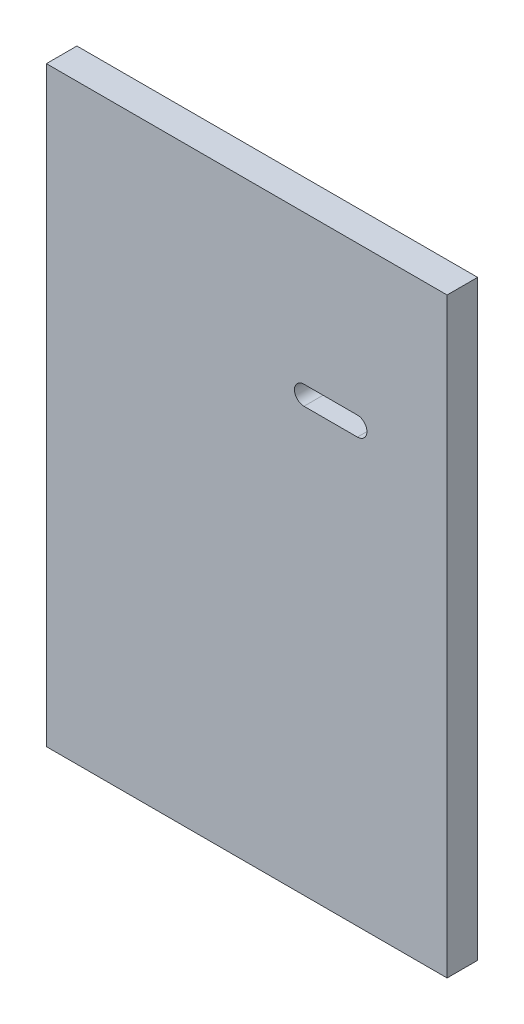
ISO-10303-21;
HEADER;
FILE_DESCRIPTION(('STEP AP214'),'2;1');
FILE_NAME('part.step','',(''),(''),'','','');
FILE_SCHEMA(('AUTOMOTIVE_DESIGN { 1 0 10303 214 1 1 1 1 }'));
ENDSEC;
DATA;
#1=APPLICATION_CONTEXT('core data for automotive mechanical design processes');
#2=APPLICATION_PROTOCOL_DEFINITION('international standard','automotive_design',2000,#1);
#3=PRODUCT_CONTEXT('',#1,'mechanical');
#4=PRODUCT('Part','Part','',(#3));
#5=PRODUCT_RELATED_PRODUCT_CATEGORY('part','',(#4));
#6=PRODUCT_DEFINITION_FORMATION('','',#4);
#7=PRODUCT_DEFINITION_CONTEXT('part definition',#1,'design');
#8=PRODUCT_DEFINITION('design','',#6,#7);
#9=PRODUCT_DEFINITION_SHAPE('','',#8);
#10=(LENGTH_UNIT() NAMED_UNIT(*) SI_UNIT(.MILLI.,.METRE.));
#11=(NAMED_UNIT(*) PLANE_ANGLE_UNIT() SI_UNIT($,.RADIAN.));
#12=(NAMED_UNIT(*) SI_UNIT($,.STERADIAN.) SOLID_ANGLE_UNIT());
#13=UNCERTAINTY_MEASURE_WITH_UNIT(LENGTH_MEASURE(1.E-05),#10,'distance_accuracy_value','');
#14=(GEOMETRIC_REPRESENTATION_CONTEXT(3) GLOBAL_UNCERTAINTY_ASSIGNED_CONTEXT((#13)) GLOBAL_UNIT_ASSIGNED_CONTEXT((#10,
#11,#12)) REPRESENTATION_CONTEXT('',''));
#15=CARTESIAN_POINT('',(0.,0.,0.));
#16=DIRECTION('',(0.,0.,1.));
#17=DIRECTION('',(1.,0.,0.));
#18=AXIS2_PLACEMENT_3D('',#15,#16,#17);
#19=CARTESIAN_POINT('',(0.,0.,0.8));
#20=DIRECTION('',(0.,0.,1.));
#21=DIRECTION('',(1.,0.,0.));
#22=AXIS2_PLACEMENT_3D('',#19,#20,#21);
#23=PLANE('',#22);
#24=CARTESIAN_POINT('',(2.9,3.6,0.8));
#25=DIRECTION('',(0.,0.,1.));
#26=DIRECTION('',(1.,0.,0.));
#27=AXIS2_PLACEMENT_3D('',#24,#25,#26);
#28=CIRCLE('',#27,0.25);
#29=CARTESIAN_POINT('',(2.9,3.85,0.8));
#30=VERTEX_POINT('',#29);
#31=CARTESIAN_POINT('',(2.9,3.35,0.8));
#32=VERTEX_POINT('',#31);
#33=EDGE_CURVE('E91',#30,#32,#28,.F.);
#34=ORIENTED_EDGE('',*,*,#33,.T.);
#35=DIRECTION('',(1.,0.,0.));
#36=VECTOR('',#35,1.);
#37=CARTESIAN_POINT('',(1.5,3.35,0.8));
#38=LINE('',#37,#36);
#39=CARTESIAN_POINT('',(1.5,3.35,0.8));
#40=VERTEX_POINT('',#39);
#41=EDGE_CURVE('E69',#32,#40,#38,.F.);
#42=ORIENTED_EDGE('',*,*,#41,.T.);
#43=CARTESIAN_POINT('',(1.5,3.6,0.8));
#44=DIRECTION('',(0.,0.,1.));
#45=DIRECTION('',(1.,0.,0.));
#46=AXIS2_PLACEMENT_3D('',#43,#44,#45);
#47=CIRCLE('',#46,0.25);
#48=CARTESIAN_POINT('',(1.5,3.85,0.8));
#49=VERTEX_POINT('',#48);
#50=EDGE_CURVE('E20',#40,#49,#47,.F.);
#51=ORIENTED_EDGE('',*,*,#50,.T.);
#52=DIRECTION('',(-1.,0.,0.));
#53=VECTOR('',#52,1.);
#54=CARTESIAN_POINT('',(2.9,3.85,0.8));
#55=LINE('',#54,#53);
#56=EDGE_CURVE('E66',#49,#30,#55,.F.);
#57=ORIENTED_EDGE('',*,*,#56,.T.);
#58=EDGE_LOOP('',(#34,#42,#51,#57));
#59=FACE_BOUND('',#58,.T.);
#60=DIRECTION('',(0.,1.,0.));
#61=VECTOR('',#60,1.);
#62=CARTESIAN_POINT('',(5.25,-7.75,0.8));
#63=LINE('',#62,#61);
#64=CARTESIAN_POINT('',(5.25,7.75,0.8));
#65=VERTEX_POINT('',#64);
#66=CARTESIAN_POINT('',(5.25,-7.75,0.8));
#67=VERTEX_POINT('',#66);
#68=EDGE_CURVE('E110',#65,#67,#63,.F.);
#69=ORIENTED_EDGE('',*,*,#68,.F.);
#70=DIRECTION('',(-1.,0.,0.));
#71=VECTOR('',#70,1.);
#72=CARTESIAN_POINT('',(5.25,7.75,0.8));
#73=LINE('',#72,#71);
#74=CARTESIAN_POINT('',(-5.25,7.75,0.8));
#75=VERTEX_POINT('',#74);
#76=EDGE_CURVE('E104',#75,#65,#73,.F.);
#77=ORIENTED_EDGE('',*,*,#76,.F.);
#78=DIRECTION('',(0.,-1.,0.));
#79=VECTOR('',#78,1.);
#80=CARTESIAN_POINT('',(-5.25,7.75,0.8));
#81=LINE('',#80,#79);
#82=CARTESIAN_POINT('',(-5.25,-7.75,0.8));
#83=VERTEX_POINT('',#82);
#84=EDGE_CURVE('E95',#83,#75,#81,.F.);
#85=ORIENTED_EDGE('',*,*,#84,.F.);
#86=DIRECTION('',(1.,0.,0.));
#87=VECTOR('',#86,1.);
#88=CARTESIAN_POINT('',(-5.25,-7.75,0.8));
#89=LINE('',#88,#87);
#90=EDGE_CURVE('E70',#67,#83,#89,.F.);
#91=ORIENTED_EDGE('',*,*,#90,.F.);
#92=EDGE_LOOP('',(#69,#77,#85,#91));
#93=FACE_BOUND('',#92,.T.);
#94=ADVANCED_FACE('F17',(#59,#93),#23,.T.);
#95=CARTESIAN_POINT('',(-5.25,-7.75,0.));
#96=DIRECTION('',(0.,-1.,0.));
#97=DIRECTION('',(1.,0.,0.));
#98=AXIS2_PLACEMENT_3D('',#95,#96,#97);
#99=PLANE('',#98);
#100=ORIENTED_EDGE('',*,*,#90,.T.);
#101=DIRECTION('',(0.,0.,1.));
#102=VECTOR('',#101,1.);
#103=CARTESIAN_POINT('',(-5.25,-7.75,0.));
#104=LINE('',#103,#102);
#105=CARTESIAN_POINT('',(-5.25,-7.75,0.));
#106=VERTEX_POINT('',#105);
#107=EDGE_CURVE('E98',#106,#83,#104,.T.);
#108=ORIENTED_EDGE('',*,*,#107,.F.);
#109=DIRECTION('',(1.,0.,0.));
#110=VECTOR('',#109,1.);
#111=CARTESIAN_POINT('',(0.,-7.75,0.));
#112=LINE('',#111,#110);
#113=CARTESIAN_POINT('',(5.25,-7.75,0.));
#114=VERTEX_POINT('',#113);
#115=EDGE_CURVE('E82',#106,#114,#112,.T.);
#116=ORIENTED_EDGE('',*,*,#115,.T.);
#117=DIRECTION('',(0.,0.,1.));
#118=VECTOR('',#117,1.);
#119=CARTESIAN_POINT('',(5.25,-7.75,0.));
#120=LINE('',#119,#118);
#121=EDGE_CURVE('E107',#67,#114,#120,.F.);
#122=ORIENTED_EDGE('',*,*,#121,.F.);
#123=EDGE_LOOP('',(#100,#108,#116,#122));
#124=FACE_BOUND('',#123,.T.);
#125=ADVANCED_FACE('F146',(#124),#99,.T.);
#126=CARTESIAN_POINT('',(5.25,-7.75,0.));
#127=DIRECTION('',(1.,0.,0.));
#128=DIRECTION('',(0.,1.,0.));
#129=AXIS2_PLACEMENT_3D('',#126,#127,#128);
#130=PLANE('',#129);
#131=ORIENTED_EDGE('',*,*,#68,.T.);
#132=ORIENTED_EDGE('',*,*,#121,.T.);
#133=DIRECTION('',(0.,1.,0.));
#134=VECTOR('',#133,1.);
#135=CARTESIAN_POINT('',(5.25,0.,0.));
#136=LINE('',#135,#134);
#137=CARTESIAN_POINT('',(5.25,7.75,0.));
#138=VERTEX_POINT('',#137);
#139=EDGE_CURVE('E136',#114,#138,#136,.T.);
#140=ORIENTED_EDGE('',*,*,#139,.T.);
#141=DIRECTION('',(0.,0.,1.));
#142=VECTOR('',#141,1.);
#143=CARTESIAN_POINT('',(5.25,7.75,0.));
#144=LINE('',#143,#142);
#145=EDGE_CURVE('E101',#65,#138,#144,.F.);
#146=ORIENTED_EDGE('',*,*,#145,.F.);
#147=EDGE_LOOP('',(#131,#132,#140,#146));
#148=FACE_BOUND('',#147,.T.);
#149=ADVANCED_FACE('F163',(#148),#130,.T.);
#150=CARTESIAN_POINT('',(5.25,7.75,0.));
#151=DIRECTION('',(0.,1.,0.));
#152=DIRECTION('',(-1.,0.,0.));
#153=AXIS2_PLACEMENT_3D('',#150,#151,#152);
#154=PLANE('',#153);
#155=ORIENTED_EDGE('',*,*,#76,.T.);
#156=ORIENTED_EDGE('',*,*,#145,.T.);
#157=DIRECTION('',(1.,0.,0.));
#158=VECTOR('',#157,1.);
#159=CARTESIAN_POINT('',(0.,7.75,0.));
#160=LINE('',#159,#158);
#161=CARTESIAN_POINT('',(-5.25,7.75,0.));
#162=VERTEX_POINT('',#161);
#163=EDGE_CURVE('E131',#138,#162,#160,.F.);
#164=ORIENTED_EDGE('',*,*,#163,.T.);
#165=DIRECTION('',(0.,0.,1.));
#166=VECTOR('',#165,1.);
#167=CARTESIAN_POINT('',(-5.25,7.75,0.));
#168=LINE('',#167,#166);
#169=EDGE_CURVE('E78',#75,#162,#168,.F.);
#170=ORIENTED_EDGE('',*,*,#169,.F.);
#171=EDGE_LOOP('',(#155,#156,#164,#170));
#172=FACE_BOUND('',#171,.T.);
#173=ADVANCED_FACE('F153',(#172),#154,.T.);
#174=CARTESIAN_POINT('',(-5.25,7.75,0.));
#175=DIRECTION('',(-1.,0.,0.));
#176=DIRECTION('',(0.,-1.,0.));
#177=AXIS2_PLACEMENT_3D('',#174,#175,#176);
#178=PLANE('',#177);
#179=ORIENTED_EDGE('',*,*,#84,.T.);
#180=ORIENTED_EDGE('',*,*,#169,.T.);
#181=DIRECTION('',(0.,1.,0.));
#182=VECTOR('',#181,1.);
#183=CARTESIAN_POINT('',(-5.25,0.,0.));
#184=LINE('',#183,#182);
#185=EDGE_CURVE('E128',#162,#106,#184,.F.);
#186=ORIENTED_EDGE('',*,*,#185,.T.);
#187=ORIENTED_EDGE('',*,*,#107,.T.);
#188=EDGE_LOOP('',(#179,#180,#186,#187));
#189=FACE_BOUND('',#188,.T.);
#190=ADVANCED_FACE('F165',(#189),#178,.T.);
#191=CARTESIAN_POINT('',(2.9,3.85,0.8));
#192=DIRECTION('',(0.,1.,0.));
#193=DIRECTION('',(-1.,0.,0.));
#194=AXIS2_PLACEMENT_3D('',#191,#192,#193);
#195=PLANE('',#194);
#196=DIRECTION('',(0.,0.,1.));
#197=VECTOR('',#196,1.);
#198=CARTESIAN_POINT('',(2.9,3.85,0.8));
#199=LINE('',#198,#197);
#200=CARTESIAN_POINT('',(2.9,3.85,0.));
#201=VERTEX_POINT('',#200);
#202=EDGE_CURVE('E77',#201,#30,#199,.T.);
#203=ORIENTED_EDGE('',*,*,#202,.T.);
#204=ORIENTED_EDGE('',*,*,#56,.F.);
#205=DIRECTION('',(0.,0.,1.));
#206=VECTOR('',#205,1.);
#207=CARTESIAN_POINT('',(1.5,3.85,0.8));
#208=LINE('',#207,#206);
#209=CARTESIAN_POINT('',(1.5,3.85,0.));
#210=VERTEX_POINT('',#209);
#211=EDGE_CURVE('E76',#49,#210,#208,.F.);
#212=ORIENTED_EDGE('',*,*,#211,.T.);
#213=DIRECTION('',(1.,0.,0.));
#214=VECTOR('',#213,1.);
#215=CARTESIAN_POINT('',(0.,3.85,0.));
#216=LINE('',#215,#214);
#217=EDGE_CURVE('E117',#210,#201,#216,.T.);
#218=ORIENTED_EDGE('',*,*,#217,.T.);
#219=EDGE_LOOP('',(#203,#204,#212,#218));
#220=FACE_BOUND('',#219,.T.);
#221=ADVANCED_FACE('F74',(#220),#195,.F.);
#222=CARTESIAN_POINT('',(2.9,3.6,0.8));
#223=DIRECTION('',(0.,0.,1.));
#224=DIRECTION('',(1.,0.,0.));
#225=AXIS2_PLACEMENT_3D('',#222,#223,#224);
#226=CYLINDRICAL_SURFACE('',#225,0.25);
#227=ORIENTED_EDGE('',*,*,#202,.F.);
#228=CARTESIAN_POINT('',(2.9,3.6,0.));
#229=DIRECTION('',(0.,0.,1.));
#230=DIRECTION('',(1.,0.,0.));
#231=AXIS2_PLACEMENT_3D('',#228,#229,#230);
#232=CIRCLE('',#231,0.25);
#233=CARTESIAN_POINT('',(2.9,3.35,0.));
#234=VERTEX_POINT('',#233);
#235=EDGE_CURVE('E115',#201,#234,#232,.F.);
#236=ORIENTED_EDGE('',*,*,#235,.T.);
#237=DIRECTION('',(0.,0.,1.));
#238=VECTOR('',#237,1.);
#239=CARTESIAN_POINT('',(2.9,3.35,0.8));
#240=LINE('',#239,#238);
#241=EDGE_CURVE('E84',#234,#32,#240,.T.);
#242=ORIENTED_EDGE('',*,*,#241,.T.);
#243=ORIENTED_EDGE('',*,*,#33,.F.);
#244=EDGE_LOOP('',(#227,#236,#242,#243));
#245=FACE_BOUND('',#244,.T.);
#246=ADVANCED_FACE('F123',(#245),#226,.F.);
#247=CARTESIAN_POINT('',(1.5,3.35,0.8));
#248=DIRECTION('',(0.,-1.,0.));
#249=DIRECTION('',(1.,0.,0.));
#250=AXIS2_PLACEMENT_3D('',#247,#248,#249);
#251=PLANE('',#250);
#252=ORIENTED_EDGE('',*,*,#241,.F.);
#253=DIRECTION('',(1.,0.,0.));
#254=VECTOR('',#253,1.);
#255=CARTESIAN_POINT('',(0.,3.35,0.));
#256=LINE('',#255,#254);
#257=CARTESIAN_POINT('',(1.5,3.35,0.));
#258=VERTEX_POINT('',#257);
#259=EDGE_CURVE('E26',#234,#258,#256,.F.);
#260=ORIENTED_EDGE('',*,*,#259,.T.);
#261=DIRECTION('',(0.,0.,1.));
#262=VECTOR('',#261,1.);
#263=CARTESIAN_POINT('',(1.5,3.35,0.8));
#264=LINE('',#263,#262);
#265=EDGE_CURVE('E34',#258,#40,#264,.T.);
#266=ORIENTED_EDGE('',*,*,#265,.T.);
#267=ORIENTED_EDGE('',*,*,#41,.F.);
#268=EDGE_LOOP('',(#252,#260,#266,#267));
#269=FACE_BOUND('',#268,.T.);
#270=ADVANCED_FACE('F120',(#269),#251,.F.);
#271=CARTESIAN_POINT('',(1.5,3.6,0.8));
#272=DIRECTION('',(0.,0.,1.));
#273=DIRECTION('',(1.,0.,0.));
#274=AXIS2_PLACEMENT_3D('',#271,#272,#273);
#275=CYLINDRICAL_SURFACE('',#274,0.25);
#276=ORIENTED_EDGE('',*,*,#265,.F.);
#277=CARTESIAN_POINT('',(1.5,3.6,0.));
#278=DIRECTION('',(0.,0.,1.));
#279=DIRECTION('',(1.,0.,0.));
#280=AXIS2_PLACEMENT_3D('',#277,#278,#279);
#281=CIRCLE('',#280,0.25);
#282=EDGE_CURVE('E11',#258,#210,#281,.F.);
#283=ORIENTED_EDGE('',*,*,#282,.T.);
#284=ORIENTED_EDGE('',*,*,#211,.F.);
#285=ORIENTED_EDGE('',*,*,#50,.F.);
#286=EDGE_LOOP('',(#276,#283,#284,#285));
#287=FACE_BOUND('',#286,.T.);
#288=ADVANCED_FACE('F80',(#287),#275,.F.);
#289=CARTESIAN_POINT('',(0.,0.,0.));
#290=DIRECTION('',(0.,0.,1.));
#291=DIRECTION('',(1.,0.,0.));
#292=AXIS2_PLACEMENT_3D('',#289,#290,#291);
#293=PLANE('',#292);
#294=ORIENTED_EDGE('',*,*,#259,.F.);
#295=ORIENTED_EDGE('',*,*,#235,.F.);
#296=ORIENTED_EDGE('',*,*,#217,.F.);
#297=ORIENTED_EDGE('',*,*,#282,.F.);
#298=EDGE_LOOP('',(#294,#295,#296,#297));
#299=FACE_BOUND('',#298,.T.);
#300=ORIENTED_EDGE('',*,*,#163,.F.);
#301=ORIENTED_EDGE('',*,*,#139,.F.);
#302=ORIENTED_EDGE('',*,*,#115,.F.);
#303=ORIENTED_EDGE('',*,*,#185,.F.);
#304=EDGE_LOOP('',(#300,#301,#302,#303));
#305=FACE_BOUND('',#304,.T.);
#306=ADVANCED_FACE('F126',(#299,#305),#293,.F.);
#307=CLOSED_SHELL('',(#94,#125,#149,#173,#190,#221,#246,#270,#288,#306));
#308=MANIFOLD_SOLID_BREP('B1',#307);
#309=ADVANCED_BREP_SHAPE_REPRESENTATION('',(#18,#308),#14);
#310=SHAPE_DEFINITION_REPRESENTATION(#9,#309);
ENDSEC;
END-ISO-10303-21;
